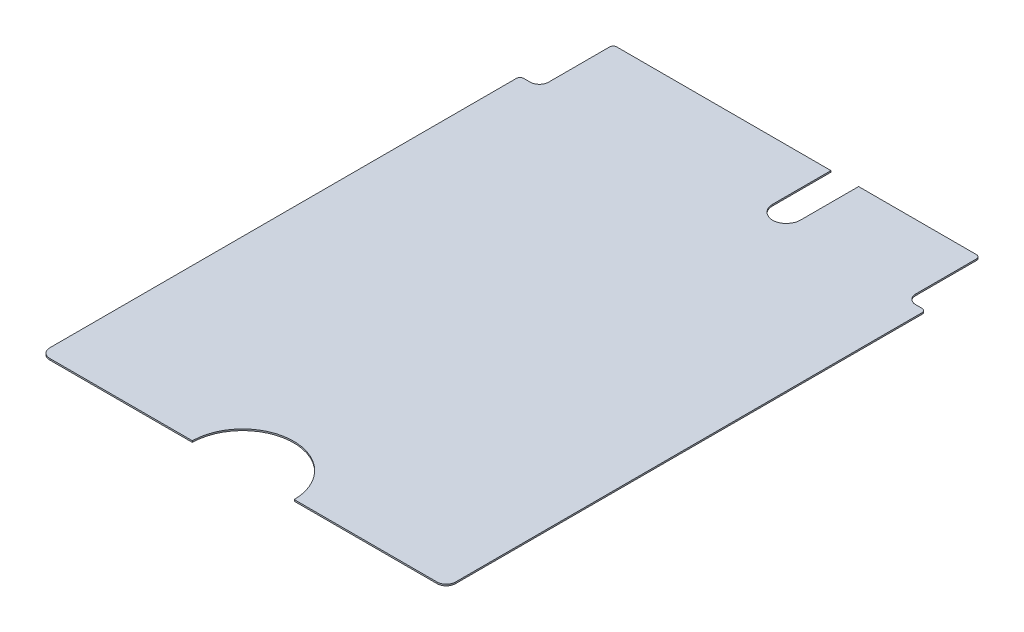
ISO-10303-21;
HEADER;
FILE_DESCRIPTION(('STEP AP214'),'2;1');
FILE_NAME('part.step','',(''),(''),'','','');
FILE_SCHEMA(('AUTOMOTIVE_DESIGN { 1 0 10303 214 1 1 1 1 }'));
ENDSEC;
DATA;
#1=APPLICATION_CONTEXT('core data for automotive mechanical design processes');
#2=APPLICATION_PROTOCOL_DEFINITION('international standard','automotive_design',2000,#1);
#3=PRODUCT_CONTEXT('',#1,'mechanical');
#4=PRODUCT('Part','Part','',(#3));
#5=PRODUCT_RELATED_PRODUCT_CATEGORY('part','',(#4));
#6=PRODUCT_DEFINITION_FORMATION('','',#4);
#7=PRODUCT_DEFINITION_CONTEXT('part definition',#1,'design');
#8=PRODUCT_DEFINITION('design','',#6,#7);
#9=PRODUCT_DEFINITION_SHAPE('','',#8);
#10=(LENGTH_UNIT() NAMED_UNIT(*) SI_UNIT(.MILLI.,.METRE.));
#11=(NAMED_UNIT(*) PLANE_ANGLE_UNIT() SI_UNIT($,.RADIAN.));
#12=(NAMED_UNIT(*) SI_UNIT($,.STERADIAN.) SOLID_ANGLE_UNIT());
#13=UNCERTAINTY_MEASURE_WITH_UNIT(LENGTH_MEASURE(1.E-05),#10,'distance_accuracy_value','');
#14=(GEOMETRIC_REPRESENTATION_CONTEXT(3) GLOBAL_UNCERTAINTY_ASSIGNED_CONTEXT((#13)) GLOBAL_UNIT_ASSIGNED_CONTEXT((#10,
#11,#12)) REPRESENTATION_CONTEXT('',''));
#15=CARTESIAN_POINT('',(0.,0.,0.));
#16=DIRECTION('',(0.,0.,1.));
#17=DIRECTION('',(1.,0.,0.));
#18=AXIS2_PLACEMENT_3D('',#15,#16,#17);
#19=CARTESIAN_POINT('',(-19.5222767349701,-34.3699379173652,9.68416125883248));
#20=DIRECTION('',(0.,1.,0.));
#21=DIRECTION('',(0.,0.,1.));
#22=AXIS2_PLACEMENT_3D('',#19,#20,#21);
#23=CYLINDRICAL_SURFACE('',#22,0.5);
#24=CARTESIAN_POINT('',(-19.5222767349701,-34.3699379173652,9.68416125883248));
#25=DIRECTION('',(0.,1.,0.));
#26=DIRECTION('',(0.,0.,1.));
#27=AXIS2_PLACEMENT_3D('',#24,#25,#26);
#28=CIRCLE('',#27,0.5);
#29=CARTESIAN_POINT('',(-19.5222767349701,-34.3699379173652,10.1841612588325));
#30=VERTEX_POINT('',#29);
#31=CARTESIAN_POINT('',(-19.0222767349701,-34.3699379173652,9.68416125883248));
#32=VERTEX_POINT('',#31);
#33=EDGE_CURVE('E239',#30,#32,#28,.T.);
#34=ORIENTED_EDGE('',*,*,#33,.F.);
#35=DIRECTION('',(0.,1.,0.));
#36=VECTOR('',#35,1.);
#37=CARTESIAN_POINT('',(-19.5222767349701,-34.3699379173652,10.1841612588325));
#38=LINE('',#37,#36);
#39=CARTESIAN_POINT('',(-19.5222767349701,-34.2899379173652,10.1841612588325));
#40=VERTEX_POINT('',#39);
#41=EDGE_CURVE('E74',#30,#40,#38,.T.);
#42=ORIENTED_EDGE('',*,*,#41,.T.);
#43=CARTESIAN_POINT('',(-19.5222767349701,-34.2899379173652,9.68416125883248));
#44=DIRECTION('',(0.,-1.,0.));
#45=DIRECTION('',(0.,0.,1.));
#46=AXIS2_PLACEMENT_3D('',#43,#44,#45);
#47=CIRCLE('',#46,0.5);
#48=CARTESIAN_POINT('',(-19.0222767349701,-34.2899379173652,9.68416125883248));
#49=VERTEX_POINT('',#48);
#50=EDGE_CURVE('E345',#49,#40,#47,.T.);
#51=ORIENTED_EDGE('',*,*,#50,.F.);
#52=DIRECTION('',(0.,1.,0.));
#53=VECTOR('',#52,1.);
#54=CARTESIAN_POINT('',(-19.0222767349701,-34.3699379173652,9.68416125883248));
#55=LINE('',#54,#53);
#56=EDGE_CURVE('E11',#32,#49,#55,.T.);
#57=ORIENTED_EDGE('',*,*,#56,.F.);
#58=EDGE_LOOP('',(#34,#42,#51,#57));
#59=FACE_BOUND('',#58,.T.);
#60=ADVANCED_FACE('F16',(#59),#23,.F.);
#61=CARTESIAN_POINT('',(-19.0222767349701,-34.3699379173652,6.3841612588325));
#62=DIRECTION('',(-1.,0.,0.));
#63=DIRECTION('',(0.,1.,0.));
#64=AXIS2_PLACEMENT_3D('',#61,#62,#63);
#65=PLANE('',#64);
#66=DIRECTION('',(0.,0.,1.));
#67=VECTOR('',#66,1.);
#68=CARTESIAN_POINT('',(-19.0222767349701,-34.3699379173652,6.3841612588325));
#69=LINE('',#68,#67);
#70=CARTESIAN_POINT('',(-19.0222767349701,-34.3699379173652,6.3841612588325));
#71=VERTEX_POINT('',#70);
#72=EDGE_CURVE('E369',#71,#32,#69,.T.);
#73=ORIENTED_EDGE('',*,*,#72,.T.);
#74=ORIENTED_EDGE('',*,*,#56,.T.);
#75=DIRECTION('',(0.,0.,1.));
#76=VECTOR('',#75,1.);
#77=CARTESIAN_POINT('',(-19.0222767349701,-34.2899379173652,6.3841612588325));
#78=LINE('',#77,#76);
#79=CARTESIAN_POINT('',(-19.0222767349701,-34.2899379173652,6.3841612588325));
#80=VERTEX_POINT('',#79);
#81=EDGE_CURVE('E284',#80,#49,#78,.T.);
#82=ORIENTED_EDGE('',*,*,#81,.F.);
#83=DIRECTION('',(0.,1.,0.));
#84=VECTOR('',#83,1.);
#85=CARTESIAN_POINT('',(-19.0222767349701,-34.3699379173652,6.3841612588325));
#86=LINE('',#85,#84);
#87=EDGE_CURVE('E26',#71,#80,#86,.T.);
#88=ORIENTED_EDGE('',*,*,#87,.F.);
#89=EDGE_LOOP('',(#73,#74,#82,#88));
#90=FACE_BOUND('',#89,.T.);
#91=ADVANCED_FACE('F18',(#90),#65,.T.);
#92=CARTESIAN_POINT('',(-18.8222767349701,-34.3699379173652,6.3841612588325));
#93=DIRECTION('',(0.,1.,0.));
#94=DIRECTION('',(0.,0.,-1.));
#95=AXIS2_PLACEMENT_3D('',#92,#93,#94);
#96=CYLINDRICAL_SURFACE('',#95,0.200000000000003);
#97=CARTESIAN_POINT('',(-18.8222767349701,-34.3699379173652,6.3841612588325));
#98=DIRECTION('',(0.,1.,0.));
#99=DIRECTION('',(0.,0.,-1.));
#100=AXIS2_PLACEMENT_3D('',#97,#98,#99);
#101=CIRCLE('',#100,0.200000000000003);
#102=CARTESIAN_POINT('',(-18.8222767349701,-34.3699379173652,6.18416125883249));
#103=VERTEX_POINT('',#102);
#104=EDGE_CURVE('E378',#103,#71,#101,.T.);
#105=ORIENTED_EDGE('',*,*,#104,.T.);
#106=ORIENTED_EDGE('',*,*,#87,.T.);
#107=CARTESIAN_POINT('',(-18.8222767349701,-34.2899379173652,6.3841612588325));
#108=DIRECTION('',(0.,1.,0.));
#109=DIRECTION('',(0.,0.,-1.));
#110=AXIS2_PLACEMENT_3D('',#107,#108,#109);
#111=CIRCLE('',#110,0.200000000000003);
#112=CARTESIAN_POINT('',(-18.8222767349701,-34.2899379173652,6.18416125883249));
#113=VERTEX_POINT('',#112);
#114=EDGE_CURVE('E437',#113,#80,#111,.T.);
#115=ORIENTED_EDGE('',*,*,#114,.F.);
#116=DIRECTION('',(0.,1.,0.));
#117=VECTOR('',#116,1.);
#118=CARTESIAN_POINT('',(-18.8222767349701,-34.3699379173652,6.18416125883249));
#119=LINE('',#118,#117);
#120=EDGE_CURVE('E307',#103,#113,#119,.T.);
#121=ORIENTED_EDGE('',*,*,#120,.F.);
#122=EDGE_LOOP('',(#105,#106,#115,#121));
#123=FACE_BOUND('',#122,.T.);
#124=ADVANCED_FACE('F500',(#123),#96,.T.);
#125=CARTESIAN_POINT('',(0.677723265029897,-34.3699379173652,6.18416125883247));
#126=DIRECTION('',(0.,0.,-1.));
#127=DIRECTION('',(-1.,0.,0.));
#128=AXIS2_PLACEMENT_3D('',#125,#126,#127);
#129=PLANE('',#128);
#130=DIRECTION('',(0.,-1.,0.));
#131=VECTOR('',#130,1.);
#132=CARTESIAN_POINT('',(-7.21499999999472,-34.3699379173652,6.18416125883247));
#133=LINE('',#132,#131);
#134=CARTESIAN_POINT('',(-7.21499999999472,-34.2899379173652,6.1841612588325));
#135=VERTEX_POINT('',#134);
#136=CARTESIAN_POINT('',(-7.21499999999472,-34.3699379173652,6.1841612588325));
#137=VERTEX_POINT('',#136);
#138=EDGE_CURVE('E349',#135,#137,#133,.T.);
#139=ORIENTED_EDGE('',*,*,#138,.T.);
#140=DIRECTION('',(-1.,0.,0.));
#141=VECTOR('',#140,1.);
#142=CARTESIAN_POINT('',(0.677723265029897,-34.3699379173652,6.18416125883247));
#143=LINE('',#142,#141);
#144=EDGE_CURVE('E381',#137,#103,#143,.T.);
#145=ORIENTED_EDGE('',*,*,#144,.T.);
#146=ORIENTED_EDGE('',*,*,#120,.T.);
#147=DIRECTION('',(-1.,0.,0.));
#148=VECTOR('',#147,1.);
#149=CARTESIAN_POINT('',(0.677723265029897,-34.2899379173652,6.18416125883247));
#150=LINE('',#149,#148);
#151=EDGE_CURVE('E303',#135,#113,#150,.T.);
#152=ORIENTED_EDGE('',*,*,#151,.F.);
#153=EDGE_LOOP('',(#139,#145,#146,#152));
#154=FACE_BOUND('',#153,.T.);
#155=ADVANCED_FACE('F497',(#154),#129,.T.);
#156=CARTESIAN_POINT('',(0.677723265029897,-34.3699379173652,6.38416125883248));
#157=DIRECTION('',(0.,1.,0.));
#158=DIRECTION('',(1.,0.,0.));
#159=AXIS2_PLACEMENT_3D('',#156,#157,#158);
#160=CYLINDRICAL_SURFACE('',#159,0.200000000000003);
#161=CARTESIAN_POINT('',(0.677723265029897,-34.3699379173652,6.38416125883248));
#162=DIRECTION('',(0.,1.,0.));
#163=DIRECTION('',(1.,0.,0.));
#164=AXIS2_PLACEMENT_3D('',#161,#162,#163);
#165=CIRCLE('',#164,0.200000000000003);
#166=CARTESIAN_POINT('',(0.877723265029857,-34.3699379173652,6.38416125883248));
#167=VERTEX_POINT('',#166);
#168=CARTESIAN_POINT('',(0.677723265029897,-34.3699379173652,6.18416125883247));
#169=VERTEX_POINT('',#168);
#170=EDGE_CURVE('E322',#167,#169,#165,.T.);
#171=ORIENTED_EDGE('',*,*,#170,.T.);
#172=DIRECTION('',(0.,1.,0.));
#173=VECTOR('',#172,1.);
#174=CARTESIAN_POINT('',(0.677723265029897,-34.3699379173652,6.18416125883247));
#175=LINE('',#174,#173);
#176=CARTESIAN_POINT('',(0.677723265029897,-34.2899379173652,6.18416125883247));
#177=VERTEX_POINT('',#176);
#178=EDGE_CURVE('E231',#169,#177,#175,.T.);
#179=ORIENTED_EDGE('',*,*,#178,.T.);
#180=CARTESIAN_POINT('',(0.677723265029897,-34.2899379173652,6.38416125883248));
#181=DIRECTION('',(0.,1.,0.));
#182=DIRECTION('',(1.,0.,0.));
#183=AXIS2_PLACEMENT_3D('',#180,#181,#182);
#184=CIRCLE('',#183,0.200000000000003);
#185=CARTESIAN_POINT('',(0.877723265029857,-34.2899379173652,6.38416125883248));
#186=VERTEX_POINT('',#185);
#187=EDGE_CURVE('E262',#186,#177,#184,.T.);
#188=ORIENTED_EDGE('',*,*,#187,.F.);
#189=DIRECTION('',(0.,1.,0.));
#190=VECTOR('',#189,1.);
#191=CARTESIAN_POINT('',(0.877723265029857,-34.3699379173652,6.38416125883248));
#192=LINE('',#191,#190);
#193=EDGE_CURVE('E190',#167,#186,#192,.T.);
#194=ORIENTED_EDGE('',*,*,#193,.F.);
#195=EDGE_LOOP('',(#171,#179,#188,#194));
#196=FACE_BOUND('',#195,.T.);
#197=ADVANCED_FACE('F578',(#196),#160,.T.);
#198=CARTESIAN_POINT('',(0.877723265029857,-34.3699379173652,9.68416125883246));
#199=DIRECTION('',(1.,0.,0.));
#200=DIRECTION('',(0.,0.,-1.));
#201=AXIS2_PLACEMENT_3D('',#198,#199,#200);
#202=PLANE('',#201);
#203=DIRECTION('',(0.,0.,-1.));
#204=VECTOR('',#203,1.);
#205=CARTESIAN_POINT('',(0.877723265029857,-34.3699379173652,9.68416125883246));
#206=LINE('',#205,#204);
#207=CARTESIAN_POINT('',(0.877723265029857,-34.3699379173652,9.68416125883246));
#208=VERTEX_POINT('',#207);
#209=EDGE_CURVE('E325',#208,#167,#206,.T.);
#210=ORIENTED_EDGE('',*,*,#209,.T.);
#211=ORIENTED_EDGE('',*,*,#193,.T.);
#212=DIRECTION('',(0.,0.,-1.));
#213=VECTOR('',#212,1.);
#214=CARTESIAN_POINT('',(0.877723265029857,-34.2899379173652,9.68416125883246));
#215=LINE('',#214,#213);
#216=CARTESIAN_POINT('',(0.877723265029857,-34.2899379173652,9.68416125883246));
#217=VERTEX_POINT('',#216);
#218=EDGE_CURVE('E265',#217,#186,#215,.T.);
#219=ORIENTED_EDGE('',*,*,#218,.F.);
#220=DIRECTION('',(0.,1.,0.));
#221=VECTOR('',#220,1.);
#222=CARTESIAN_POINT('',(0.877723265029857,-34.3699379173652,9.68416125883246));
#223=LINE('',#222,#221);
#224=EDGE_CURVE('E179',#208,#217,#223,.T.);
#225=ORIENTED_EDGE('',*,*,#224,.F.);
#226=EDGE_LOOP('',(#210,#211,#219,#225));
#227=FACE_BOUND('',#226,.T.);
#228=ADVANCED_FACE('F464',(#227),#202,.T.);
#229=CARTESIAN_POINT('',(1.37772326502997,-34.3699379173652,9.68416125883246));
#230=DIRECTION('',(0.,1.,0.));
#231=DIRECTION('',(-1.,0.,0.));
#232=AXIS2_PLACEMENT_3D('',#229,#230,#231);
#233=CYLINDRICAL_SURFACE('',#232,0.5);
#234=CARTESIAN_POINT('',(1.37772326502997,-34.3699379173652,9.68416125883246));
#235=DIRECTION('',(0.,1.,0.));
#236=DIRECTION('',(-1.,0.,0.));
#237=AXIS2_PLACEMENT_3D('',#234,#235,#236);
#238=CIRCLE('',#237,0.5);
#239=CARTESIAN_POINT('',(1.37772326502997,-34.3699379173652,10.1841612588325));
#240=VERTEX_POINT('',#239);
#241=EDGE_CURVE('E335',#208,#240,#238,.T.);
#242=ORIENTED_EDGE('',*,*,#241,.F.);
#243=ORIENTED_EDGE('',*,*,#224,.T.);
#244=CARTESIAN_POINT('',(1.37772326502997,-34.2899379173652,9.68416125883246));
#245=DIRECTION('',(0.,-1.,0.));
#246=DIRECTION('',(-1.,0.,0.));
#247=AXIS2_PLACEMENT_3D('',#244,#245,#246);
#248=CIRCLE('',#247,0.5);
#249=CARTESIAN_POINT('',(1.37772326502997,-34.2899379173652,10.1841612588325));
#250=VERTEX_POINT('',#249);
#251=EDGE_CURVE('E273',#250,#217,#248,.T.);
#252=ORIENTED_EDGE('',*,*,#251,.F.);
#253=DIRECTION('',(0.,1.,0.));
#254=VECTOR('',#253,1.);
#255=CARTESIAN_POINT('',(1.37772326502997,-34.3699379173652,10.1841612588325));
#256=LINE('',#255,#254);
#257=EDGE_CURVE('E375',#240,#250,#256,.T.);
#258=ORIENTED_EDGE('',*,*,#257,.F.);
#259=EDGE_LOOP('',(#242,#243,#252,#258));
#260=FACE_BOUND('',#259,.T.);
#261=ADVANCED_FACE('F462',(#260),#233,.F.);
#262=CARTESIAN_POINT('',(1.72772326502994,-34.3699379173652,10.1841612588325));
#263=DIRECTION('',(0.,0.,-1.));
#264=DIRECTION('',(-1.,0.,0.));
#265=AXIS2_PLACEMENT_3D('',#262,#263,#264);
#266=PLANE('',#265);
#267=DIRECTION('',(-1.,0.,0.));
#268=VECTOR('',#267,1.);
#269=CARTESIAN_POINT('',(1.72772326502994,-34.3699379173652,10.1841612588325));
#270=LINE('',#269,#268);
#271=CARTESIAN_POINT('',(1.72772326502994,-34.3699379173652,10.1841612588325));
#272=VERTEX_POINT('',#271);
#273=EDGE_CURVE('E330',#272,#240,#270,.T.);
#274=ORIENTED_EDGE('',*,*,#273,.T.);
#275=ORIENTED_EDGE('',*,*,#257,.T.);
#276=DIRECTION('',(-1.,0.,0.));
#277=VECTOR('',#276,1.);
#278=CARTESIAN_POINT('',(1.72772326502994,-34.2899379173652,10.1841612588325));
#279=LINE('',#278,#277);
#280=CARTESIAN_POINT('',(1.72772326502994,-34.2899379173652,10.1841612588325));
#281=VERTEX_POINT('',#280);
#282=EDGE_CURVE('E280',#281,#250,#279,.T.);
#283=ORIENTED_EDGE('',*,*,#282,.F.);
#284=DIRECTION('',(0.,1.,0.));
#285=VECTOR('',#284,1.);
#286=CARTESIAN_POINT('',(1.72772326502994,-34.3699379173652,10.1841612588325));
#287=LINE('',#286,#285);
#288=EDGE_CURVE('E256',#272,#281,#287,.T.);
#289=ORIENTED_EDGE('',*,*,#288,.F.);
#290=EDGE_LOOP('',(#274,#275,#283,#289));
#291=FACE_BOUND('',#290,.T.);
#292=ADVANCED_FACE('F471',(#291),#266,.T.);
#293=CARTESIAN_POINT('',(1.72772326502994,-34.3699379173652,10.3841612588325));
#294=DIRECTION('',(0.,1.,0.));
#295=DIRECTION('',(1.,0.,0.));
#296=AXIS2_PLACEMENT_3D('',#293,#294,#295);
#297=CYLINDRICAL_SURFACE('',#296,0.200000000000003);
#298=CARTESIAN_POINT('',(1.72772326502994,-34.3699379173652,10.3841612588325));
#299=DIRECTION('',(0.,1.,0.));
#300=DIRECTION('',(1.,0.,0.));
#301=AXIS2_PLACEMENT_3D('',#298,#299,#300);
#302=CIRCLE('',#301,0.200000000000003);
#303=CARTESIAN_POINT('',(1.9277232650299,-34.3699379173652,10.3841612588325));
#304=VERTEX_POINT('',#303);
#305=EDGE_CURVE('E334',#304,#272,#302,.T.);
#306=ORIENTED_EDGE('',*,*,#305,.T.);
#307=ORIENTED_EDGE('',*,*,#288,.T.);
#308=CARTESIAN_POINT('',(1.72772326502994,-34.2899379173652,10.3841612588325));
#309=DIRECTION('',(0.,1.,0.));
#310=DIRECTION('',(1.,0.,0.));
#311=AXIS2_PLACEMENT_3D('',#308,#309,#310);
#312=CIRCLE('',#311,0.200000000000003);
#313=CARTESIAN_POINT('',(1.9277232650299,-34.2899379173652,10.3841612588325));
#314=VERTEX_POINT('',#313);
#315=EDGE_CURVE('E299',#314,#281,#312,.T.);
#316=ORIENTED_EDGE('',*,*,#315,.F.);
#317=DIRECTION('',(0.,1.,0.));
#318=VECTOR('',#317,1.);
#319=CARTESIAN_POINT('',(1.9277232650299,-34.3699379173652,10.3841612588325));
#320=LINE('',#319,#318);
#321=EDGE_CURVE('E445',#304,#314,#320,.T.);
#322=ORIENTED_EDGE('',*,*,#321,.F.);
#323=EDGE_LOOP('',(#306,#307,#316,#322));
#324=FACE_BOUND('',#323,.T.);
#325=ADVANCED_FACE('F549',(#324),#297,.T.);
#326=CARTESIAN_POINT('',(1.9277232650299,-34.3699379173652,35.6841612588325));
#327=DIRECTION('',(1.,0.,0.));
#328=DIRECTION('',(0.,0.,-1.));
#329=AXIS2_PLACEMENT_3D('',#326,#327,#328);
#330=PLANE('',#329);
#331=DIRECTION('',(0.,0.,-1.));
#332=VECTOR('',#331,1.);
#333=CARTESIAN_POINT('',(1.9277232650299,-34.3699379173652,35.6841612588325));
#334=LINE('',#333,#332);
#335=CARTESIAN_POINT('',(1.9277232650299,-34.3699379173652,35.6841612588325));
#336=VERTEX_POINT('',#335);
#337=EDGE_CURVE('E360',#336,#304,#334,.T.);
#338=ORIENTED_EDGE('',*,*,#337,.T.);
#339=ORIENTED_EDGE('',*,*,#321,.T.);
#340=DIRECTION('',(0.,0.,-1.));
#341=VECTOR('',#340,1.);
#342=CARTESIAN_POINT('',(1.9277232650299,-34.2899379173652,35.6841612588325));
#343=LINE('',#342,#341);
#344=CARTESIAN_POINT('',(1.9277232650299,-34.2899379173652,35.6841612588325));
#345=VERTEX_POINT('',#344);
#346=EDGE_CURVE('E295',#345,#314,#343,.T.);
#347=ORIENTED_EDGE('',*,*,#346,.F.);
#348=DIRECTION('',(0.,1.,0.));
#349=VECTOR('',#348,1.);
#350=CARTESIAN_POINT('',(1.9277232650299,-34.3699379173652,35.6841612588325));
#351=LINE('',#350,#349);
#352=EDGE_CURVE('E39',#336,#345,#351,.T.);
#353=ORIENTED_EDGE('',*,*,#352,.F.);
#354=EDGE_LOOP('',(#338,#339,#347,#353));
#355=FACE_BOUND('',#354,.T.);
#356=ADVANCED_FACE('F547',(#355),#330,.T.);
#357=CARTESIAN_POINT('',(1.42772326502993,-34.3699379173652,35.6841612588325));
#358=DIRECTION('',(0.,1.,0.));
#359=DIRECTION('',(0.,0.,1.));
#360=AXIS2_PLACEMENT_3D('',#357,#358,#359);
#361=CYLINDRICAL_SURFACE('',#360,0.5);
#362=CARTESIAN_POINT('',(1.42772326502993,-34.3699379173652,35.6841612588325));
#363=DIRECTION('',(0.,1.,0.));
#364=DIRECTION('',(0.,0.,1.));
#365=AXIS2_PLACEMENT_3D('',#362,#363,#364);
#366=CIRCLE('',#365,0.5);
#367=CARTESIAN_POINT('',(1.42772326502993,-34.3699379173652,36.1841612588325));
#368=VERTEX_POINT('',#367);
#369=EDGE_CURVE('E340',#368,#336,#366,.T.);
#370=ORIENTED_EDGE('',*,*,#369,.T.);
#371=ORIENTED_EDGE('',*,*,#352,.T.);
#372=CARTESIAN_POINT('',(1.42772326502993,-34.2899379173652,35.6841612588325));
#373=DIRECTION('',(0.,1.,0.));
#374=DIRECTION('',(0.,0.,1.));
#375=AXIS2_PLACEMENT_3D('',#372,#373,#374);
#376=CIRCLE('',#375,0.5);
#377=CARTESIAN_POINT('',(1.42772326502993,-34.2899379173652,36.1841612588325));
#378=VERTEX_POINT('',#377);
#379=EDGE_CURVE('E293',#378,#345,#376,.T.);
#380=ORIENTED_EDGE('',*,*,#379,.F.);
#381=DIRECTION('',(0.,1.,0.));
#382=VECTOR('',#381,1.);
#383=CARTESIAN_POINT('',(1.42772326502993,-34.3699379173652,36.1841612588325));
#384=LINE('',#383,#382);
#385=EDGE_CURVE('E365',#368,#378,#384,.T.);
#386=ORIENTED_EDGE('',*,*,#385,.F.);
#387=EDGE_LOOP('',(#370,#371,#380,#386));
#388=FACE_BOUND('',#387,.T.);
#389=ADVANCED_FACE('F521',(#388),#361,.T.);
#390=CARTESIAN_POINT('',(-19.5722767349702,-34.3699379173652,35.6841612588325));
#391=DIRECTION('',(0.,1.,0.));
#392=DIRECTION('',(-1.,0.,0.));
#393=AXIS2_PLACEMENT_3D('',#390,#391,#392);
#394=CYLINDRICAL_SURFACE('',#393,0.5);
#395=CARTESIAN_POINT('',(-19.5722767349702,-34.3699379173652,35.6841612588325));
#396=DIRECTION('',(0.,1.,0.));
#397=DIRECTION('',(-1.,0.,0.));
#398=AXIS2_PLACEMENT_3D('',#395,#396,#397);
#399=CIRCLE('',#398,0.5);
#400=CARTESIAN_POINT('',(-20.0722767349701,-34.3699379173652,35.6841612588325));
#401=VERTEX_POINT('',#400);
#402=CARTESIAN_POINT('',(-19.5722767349702,-34.3699379173652,36.1841612588325));
#403=VERTEX_POINT('',#402);
#404=EDGE_CURVE('E252',#401,#403,#399,.T.);
#405=ORIENTED_EDGE('',*,*,#404,.T.);
#406=DIRECTION('',(0.,1.,0.));
#407=VECTOR('',#406,1.);
#408=CARTESIAN_POINT('',(-19.5722767349702,-34.3699379173652,36.1841612588325));
#409=LINE('',#408,#407);
#410=CARTESIAN_POINT('',(-19.5722767349702,-34.2899379173652,36.1841612588325));
#411=VERTEX_POINT('',#410);
#412=EDGE_CURVE('E336',#403,#411,#409,.T.);
#413=ORIENTED_EDGE('',*,*,#412,.T.);
#414=CARTESIAN_POINT('',(-19.5722767349702,-34.2899379173652,35.6841612588325));
#415=DIRECTION('',(0.,1.,0.));
#416=DIRECTION('',(-1.,0.,0.));
#417=AXIS2_PLACEMENT_3D('',#414,#415,#416);
#418=CIRCLE('',#417,0.5);
#419=CARTESIAN_POINT('',(-20.0722767349701,-34.2899379173652,35.6841612588325));
#420=VERTEX_POINT('',#419);
#421=EDGE_CURVE('E433',#420,#411,#418,.T.);
#422=ORIENTED_EDGE('',*,*,#421,.F.);
#423=DIRECTION('',(0.,1.,0.));
#424=VECTOR('',#423,1.);
#425=CARTESIAN_POINT('',(-20.0722767349701,-34.3699379173652,35.6841612588325));
#426=LINE('',#425,#424);
#427=EDGE_CURVE('E288',#401,#420,#426,.T.);
#428=ORIENTED_EDGE('',*,*,#427,.F.);
#429=EDGE_LOOP('',(#405,#413,#422,#428));
#430=FACE_BOUND('',#429,.T.);
#431=ADVANCED_FACE('F531',(#430),#394,.T.);
#432=CARTESIAN_POINT('',(-20.0722767349701,-34.3699379173652,10.3841612588325));
#433=DIRECTION('',(-1.,0.,0.));
#434=DIRECTION('',(0.,1.,0.));
#435=AXIS2_PLACEMENT_3D('',#432,#433,#434);
#436=PLANE('',#435);
#437=DIRECTION('',(0.,0.,1.));
#438=VECTOR('',#437,1.);
#439=CARTESIAN_POINT('',(-20.0722767349701,-34.3699379173652,10.3841612588325));
#440=LINE('',#439,#438);
#441=CARTESIAN_POINT('',(-20.0722767349701,-34.3699379173652,10.3841612588325));
#442=VERTEX_POINT('',#441);
#443=EDGE_CURVE('E245',#442,#401,#440,.T.);
#444=ORIENTED_EDGE('',*,*,#443,.T.);
#445=ORIENTED_EDGE('',*,*,#427,.T.);
#446=DIRECTION('',(0.,0.,1.));
#447=VECTOR('',#446,1.);
#448=CARTESIAN_POINT('',(-20.0722767349701,-34.2899379173652,10.3841612588325));
#449=LINE('',#448,#447);
#450=CARTESIAN_POINT('',(-20.0722767349701,-34.2899379173652,10.3841612588325));
#451=VERTEX_POINT('',#450);
#452=EDGE_CURVE('E318',#451,#420,#449,.T.);
#453=ORIENTED_EDGE('',*,*,#452,.F.);
#454=DIRECTION('',(0.,1.,0.));
#455=VECTOR('',#454,1.);
#456=CARTESIAN_POINT('',(-20.0722767349701,-34.3699379173652,10.3841612588325));
#457=LINE('',#456,#455);
#458=EDGE_CURVE('E286',#442,#451,#457,.T.);
#459=ORIENTED_EDGE('',*,*,#458,.F.);
#460=EDGE_LOOP('',(#444,#445,#453,#459));
#461=FACE_BOUND('',#460,.T.);
#462=ADVANCED_FACE('F536',(#461),#436,.T.);
#463=CARTESIAN_POINT('',(-19.87227673497,-34.3699379173652,10.3841612588325));
#464=DIRECTION('',(0.,1.,0.));
#465=DIRECTION('',(0.,0.,-1.));
#466=AXIS2_PLACEMENT_3D('',#463,#464,#465);
#467=CYLINDRICAL_SURFACE('',#466,0.2);
#468=CARTESIAN_POINT('',(-19.87227673497,-34.3699379173652,10.3841612588325));
#469=DIRECTION('',(0.,1.,0.));
#470=DIRECTION('',(0.,0.,-1.));
#471=AXIS2_PLACEMENT_3D('',#468,#469,#470);
#472=CIRCLE('',#471,0.2);
#473=CARTESIAN_POINT('',(-19.87227673497,-34.3699379173652,10.1841612588325));
#474=VERTEX_POINT('',#473);
#475=EDGE_CURVE('E224',#474,#442,#472,.T.);
#476=ORIENTED_EDGE('',*,*,#475,.T.);
#477=ORIENTED_EDGE('',*,*,#458,.T.);
#478=CARTESIAN_POINT('',(-19.87227673497,-34.2899379173652,10.3841612588325));
#479=DIRECTION('',(0.,1.,0.));
#480=DIRECTION('',(0.,0.,-1.));
#481=AXIS2_PLACEMENT_3D('',#478,#479,#480);
#482=CIRCLE('',#481,0.2);
#483=CARTESIAN_POINT('',(-19.87227673497,-34.2899379173652,10.1841612588325));
#484=VERTEX_POINT('',#483);
#485=EDGE_CURVE('E227',#484,#451,#482,.T.);
#486=ORIENTED_EDGE('',*,*,#485,.F.);
#487=DIRECTION('',(0.,1.,0.));
#488=VECTOR('',#487,1.);
#489=CARTESIAN_POINT('',(-19.87227673497,-34.3699379173652,10.1841612588325));
#490=LINE('',#489,#488);
#491=EDGE_CURVE('E220',#474,#484,#490,.T.);
#492=ORIENTED_EDGE('',*,*,#491,.F.);
#493=EDGE_LOOP('',(#476,#477,#486,#492));
#494=FACE_BOUND('',#493,.T.);
#495=ADVANCED_FACE('F222',(#494),#467,.T.);
#496=CARTESIAN_POINT('',(-19.5222767349701,-34.3699379173652,10.1841612588325));
#497=DIRECTION('',(0.,0.,-1.));
#498=DIRECTION('',(-1.,0.,0.));
#499=AXIS2_PLACEMENT_3D('',#496,#497,#498);
#500=PLANE('',#499);
#501=DIRECTION('',(-1.,0.,0.));
#502=VECTOR('',#501,1.);
#503=CARTESIAN_POINT('',(-19.5222767349701,-34.3699379173652,10.1841612588325));
#504=LINE('',#503,#502);
#505=EDGE_CURVE('E234',#30,#474,#504,.T.);
#506=ORIENTED_EDGE('',*,*,#505,.T.);
#507=ORIENTED_EDGE('',*,*,#491,.T.);
#508=DIRECTION('',(-1.,0.,0.));
#509=VECTOR('',#508,1.);
#510=CARTESIAN_POINT('',(-19.5222767349701,-34.2899379173652,10.1841612588325));
#511=LINE('',#510,#509);
#512=EDGE_CURVE('E319',#40,#484,#511,.T.);
#513=ORIENTED_EDGE('',*,*,#512,.F.);
#514=ORIENTED_EDGE('',*,*,#41,.F.);
#515=EDGE_LOOP('',(#506,#507,#513,#514));
#516=FACE_BOUND('',#515,.T.);
#517=ADVANCED_FACE('F235',(#516),#500,.T.);
#518=CARTESIAN_POINT('',(0.677723265029897,-34.3699379173652,6.18416125883247));
#519=DIRECTION('',(0.,0.,-1.));
#520=DIRECTION('',(-1.,0.,0.));
#521=AXIS2_PLACEMENT_3D('',#518,#519,#520);
#522=PLANE('',#521);
#523=DIRECTION('',(0.,1.,0.));
#524=VECTOR('',#523,1.);
#525=CARTESIAN_POINT('',(-5.71500000000405,-34.3699379173652,6.18416125883247));
#526=LINE('',#525,#524);
#527=CARTESIAN_POINT('',(-5.71500000000405,-34.3699379173652,6.1841612588325));
#528=VERTEX_POINT('',#527);
#529=CARTESIAN_POINT('',(-5.71500000000405,-34.2899379173652,6.1841612588325));
#530=VERTEX_POINT('',#529);
#531=EDGE_CURVE('E406',#528,#530,#526,.T.);
#532=ORIENTED_EDGE('',*,*,#531,.T.);
#533=DIRECTION('',(-1.,0.,0.));
#534=VECTOR('',#533,1.);
#535=CARTESIAN_POINT('',(0.677723265029897,-34.2899379173652,6.18416125883247));
#536=LINE('',#535,#534);
#537=EDGE_CURVE('E261',#177,#530,#536,.T.);
#538=ORIENTED_EDGE('',*,*,#537,.F.);
#539=ORIENTED_EDGE('',*,*,#178,.F.);
#540=DIRECTION('',(-1.,0.,0.));
#541=VECTOR('',#540,1.);
#542=CARTESIAN_POINT('',(0.677723265029897,-34.3699379173652,6.18416125883247));
#543=LINE('',#542,#541);
#544=EDGE_CURVE('E326',#169,#528,#543,.T.);
#545=ORIENTED_EDGE('',*,*,#544,.T.);
#546=EDGE_LOOP('',(#532,#538,#539,#545));
#547=FACE_BOUND('',#546,.T.);
#548=ADVANCED_FACE('F599',(#547),#522,.T.);
#549=CARTESIAN_POINT('',(-7.21499999999472,-34.3699379173652,6.1841612588325));
#550=DIRECTION('',(-1.,0.,0.));
#551=DIRECTION('',(0.,0.,1.));
#552=AXIS2_PLACEMENT_3D('',#549,#550,#551);
#553=PLANE('',#552);
#554=DIRECTION('',(0.,0.,1.));
#555=VECTOR('',#554,1.);
#556=CARTESIAN_POINT('',(-7.21499999999471,-34.3699379173652,2.93418625883247));
#557=LINE('',#556,#555);
#558=CARTESIAN_POINT('',(-7.21499999999221,-34.3699379173652,9.35003153362687));
#559=VERTEX_POINT('',#558);
#560=EDGE_CURVE('E388',#137,#559,#557,.T.);
#561=ORIENTED_EDGE('',*,*,#560,.F.);
#562=ORIENTED_EDGE('',*,*,#138,.F.);
#563=DIRECTION('',(0.,0.,-1.));
#564=VECTOR('',#563,1.);
#565=CARTESIAN_POINT('',(-7.21499999999471,-34.2899379173652,2.93418625883247));
#566=LINE('',#565,#564);
#567=CARTESIAN_POINT('',(-7.21499999999221,-34.2899379173652,9.35003153362687));
#568=VERTEX_POINT('',#567);
#569=EDGE_CURVE('E300',#568,#135,#566,.T.);
#570=ORIENTED_EDGE('',*,*,#569,.F.);
#571=DIRECTION('',(0.,1.,0.));
#572=VECTOR('',#571,1.);
#573=CARTESIAN_POINT('',(-7.21499999999221,-34.3699379173652,9.35003153362687));
#574=LINE('',#573,#572);
#575=EDGE_CURVE('E353',#559,#568,#574,.T.);
#576=ORIENTED_EDGE('',*,*,#575,.F.);
#577=EDGE_LOOP('',(#561,#562,#570,#576));
#578=FACE_BOUND('',#577,.T.);
#579=ADVANCED_FACE('F602',(#578),#553,.F.);
#580=CARTESIAN_POINT('',(-7.21499999999221,-34.3699379173652,9.35003153362687));
#581=CARTESIAN_POINT('',(-7.21499999999221,-34.2899379173652,9.35003153362687));
#582=CARTESIAN_POINT('',(-7.21499972228489,-34.3699379173652,9.40970292928749));
#583=CARTESIAN_POINT('',(-7.21499972228489,-34.2899379173652,9.40970292928749));
#584=CARTESIAN_POINT('',(-7.20784447686593,-34.3699379173652,9.46937107249866));
#585=CARTESIAN_POINT('',(-7.20784447686593,-34.2899379173652,9.46937107249866));
#586=CARTESIAN_POINT('',(-7.19373635685648,-34.3699379173652,9.52735069314218));
#587=CARTESIAN_POINT('',(-7.19373635685648,-34.2899379173652,9.52735069314218));
#588=CARTESIAN_POINT('',(-7.10783669670301,-34.3699379173652,9.88036935939766));
#589=CARTESIAN_POINT('',(-7.10783669670301,-34.2899379173652,9.88036935939766));
#590=CARTESIAN_POINT('',(-6.73499919631506,-34.3699379173652,10.1384450421497));
#591=CARTESIAN_POINT('',(-6.73499919631506,-34.2899379173652,10.1384450421497));
#592=CARTESIAN_POINT('',(-6.37434382235639,-34.3699379173652,10.0945288540557));
#593=CARTESIAN_POINT('',(-6.37434382235639,-34.2899379173652,10.0945288540557));
#594=CARTESIAN_POINT('',(-6.01459595014111,-34.3699379173652,10.0507231703937));
#595=CARTESIAN_POINT('',(-6.01459595014111,-34.2899379173652,10.0507231703937));
#596=CARTESIAN_POINT('',(-5.71500168664371,-34.3699379173652,9.71243665157274));
#597=CARTESIAN_POINT('',(-5.71500168664371,-34.2899379173652,9.71243665157274));
#598=CARTESIAN_POINT('',(-5.71500000000765,-34.3699379173652,9.35003153367453));
#599=CARTESIAN_POINT('',(-5.71500000000765,-34.2899379173652,9.35003153367453));
#600=(BOUNDED_SURFACE() B_SPLINE_SURFACE(3,1,((#580,#581),(#582,#583),(#584,#585),(#586,#587),
(#588,#589),(#590,#591),(#592,#593),(#594,#595),(#596,#597),(#598,#599)),.UNSPECIFIED.,.F.,.F.,
.F.) B_SPLINE_SURFACE_WITH_KNOTS((4,3,3,4),(2,2),(1.29039237993196E-06,0.238686873043451,
1.69196416438608,3.14158463603113),(0.,0.008),
.UNSPECIFIED.) GEOMETRIC_REPRESENTATION_ITEM() RATIONAL_B_SPLINE_SURFACE(((1.,1.),(1.,1.),(1.,
1.),(1.,1.),(1.,1.),(1.,1.),(1.,1.),(1.,1.),(1.,1.),(1.,1.))) REPRESENTATION_ITEM('') SURFACE());
#601=CARTESIAN_POINT('',(-7.21499999999221,-34.3699379173652,9.35003153362687));
#602=CARTESIAN_POINT('',(-7.21499972228489,-34.3699379173652,9.40970292928749));
#603=CARTESIAN_POINT('',(-7.20784447686593,-34.3699379173652,9.46937107249866));
#604=CARTESIAN_POINT('',(-7.19373635685648,-34.3699379173652,9.52735069314218));
#605=CARTESIAN_POINT('',(-7.10783669670301,-34.3699379173652,9.88036935939766));
#606=CARTESIAN_POINT('',(-6.73499919631506,-34.3699379173652,10.1384450421497));
#607=CARTESIAN_POINT('',(-6.37434382235639,-34.3699379173652,10.0945288540557));
#608=CARTESIAN_POINT('',(-6.01459595014111,-34.3699379173652,10.0507231703937));
#609=CARTESIAN_POINT('',(-5.71500168664371,-34.3699379173652,9.71243665157274));
#610=CARTESIAN_POINT('',(-5.71500000000765,-34.3699379173652,9.35003153367453));
#611=(BOUNDED_CURVE() B_SPLINE_CURVE(3,(#601,#602,#603,#604,#605,#606,#607,#608,#609,#610),
.UNSPECIFIED.,.F.,.F.) B_SPLINE_CURVE_WITH_KNOTS((4,3,3,4),(1.29039237993196E-06,
0.238686873043451,1.69196416438608,3.14158463603113),
.UNSPECIFIED.) CURVE() GEOMETRIC_REPRESENTATION_ITEM() RATIONAL_B_SPLINE_CURVE((1.,1.,1.,1.,1.,
1.,1.,1.,1.,1.)) REPRESENTATION_ITEM(''));
#612=CARTESIAN_POINT('',(-5.71500000000765,-34.3699379173652,9.35003153367453));
#613=VERTEX_POINT('',#612);
#614=EDGE_CURVE('E374',#559,#613,#611,.T.);
#615=CARTESIAN_POINT('',(-5.71500000000765,-34.2899379173652,9.35003153367453));
#616=CARTESIAN_POINT('',(-5.71500168664371,-34.2899379173652,9.71243665157274));
#617=CARTESIAN_POINT('',(-6.01459595014111,-34.2899379173652,10.0507231703937));
#618=CARTESIAN_POINT('',(-6.37434382235639,-34.2899379173652,10.0945288540557));
#619=CARTESIAN_POINT('',(-6.73499919631506,-34.2899379173652,10.1384450421497));
#620=CARTESIAN_POINT('',(-7.10783669670301,-34.2899379173652,9.88036935939766));
#621=CARTESIAN_POINT('',(-7.19373635685648,-34.2899379173652,9.52735069314218));
#622=CARTESIAN_POINT('',(-7.20784447686593,-34.2899379173652,9.46937107249866));
#623=CARTESIAN_POINT('',(-7.21499972228489,-34.2899379173652,9.40970292928749));
#624=CARTESIAN_POINT('',(-7.21499999999221,-34.2899379173652,9.35003153362687));
#625=(BOUNDED_CURVE() B_SPLINE_CURVE(3,(#615,#616,#617,#618,#619,#620,#621,#622,#623,#624),
.UNSPECIFIED.,.F.,.F.) B_SPLINE_CURVE_WITH_KNOTS((4,3,3,4),(-3.14158463603113,-1.69196416438608,
-0.238686873043451,-1.29039237993196E-06),
.UNSPECIFIED.) CURVE() GEOMETRIC_REPRESENTATION_ITEM() RATIONAL_B_SPLINE_CURVE((1.,1.,1.,1.,1.,
1.,1.,1.,1.,1.)) REPRESENTATION_ITEM(''));
#626=CARTESIAN_POINT('',(-5.71500000000765,-34.2899379173652,9.35003153367453));
#627=VERTEX_POINT('',#626);
#628=EDGE_CURVE('E260',#627,#568,#625,.T.);
#629=DIRECTION('',(0.,1.,0.));
#630=VECTOR('',#629,1.);
#631=CARTESIAN_POINT('',(-5.71500000000765,-34.3699379173652,9.35003153367453));
#632=LINE('',#631,#630);
#633=EDGE_CURVE('E339',#613,#627,#632,.T.);
#634=ORIENTED_EDGE('',*,*,#614,.F.);
#635=ORIENTED_EDGE('',*,*,#575,.T.);
#636=ORIENTED_EDGE('',*,*,#628,.F.);
#637=ORIENTED_EDGE('',*,*,#633,.F.);
#638=EDGE_LOOP('',(#634,#635,#636,#637));
#639=FACE_BOUND('',#638,.T.);
#640=ADVANCED_FACE('F596',(#639),#600,.F.);
#641=CARTESIAN_POINT('',(-5.71500000000405,-34.3699379173652,9.35003153367453));
#642=DIRECTION('',(1.,0.,0.));
#643=DIRECTION('',(0.,0.,-1.));
#644=AXIS2_PLACEMENT_3D('',#641,#642,#643);
#645=PLANE('',#644);
#646=DIRECTION('',(0.,0.,-1.));
#647=VECTOR('',#646,1.);
#648=CARTESIAN_POINT('',(-5.71500000000406,-34.3699379173652,4.51712139625357));
#649=LINE('',#648,#647);
#650=EDGE_CURVE('E370',#613,#528,#649,.T.);
#651=ORIENTED_EDGE('',*,*,#650,.F.);
#652=ORIENTED_EDGE('',*,*,#633,.T.);
#653=DIRECTION('',(0.,0.,1.));
#654=VECTOR('',#653,1.);
#655=CARTESIAN_POINT('',(-5.71500000000406,-34.2899379173652,4.51712139625357));
#656=LINE('',#655,#654);
#657=EDGE_CURVE('E258',#530,#627,#656,.T.);
#658=ORIENTED_EDGE('',*,*,#657,.F.);
#659=ORIENTED_EDGE('',*,*,#531,.F.);
#660=EDGE_LOOP('',(#651,#652,#658,#659));
#661=FACE_BOUND('',#660,.T.);
#662=ADVANCED_FACE('F575',(#661),#645,.F.);
#663=CARTESIAN_POINT('',(-19.5722767349702,-34.3699379173652,36.1841612588325));
#664=DIRECTION('',(0.,0.,1.));
#665=DIRECTION('',(1.,0.,0.));
#666=AXIS2_PLACEMENT_3D('',#663,#664,#665);
#667=PLANE('',#666);
#668=DIRECTION('',(0.,1.,0.));
#669=VECTOR('',#668,1.);
#670=CARTESIAN_POINT('',(-11.8436051344364,-34.3699379173652,36.1841612588325));
#671=LINE('',#670,#669);
#672=CARTESIAN_POINT('',(-11.8436051344364,-34.3699379173652,36.1841612588325));
#673=VERTEX_POINT('',#672);
#674=CARTESIAN_POINT('',(-11.8436051344364,-34.2899379173652,36.1841612588325));
#675=VERTEX_POINT('',#674);
#676=EDGE_CURVE('E294',#673,#675,#671,.T.);
#677=ORIENTED_EDGE('',*,*,#676,.T.);
#678=DIRECTION('',(1.,0.,0.));
#679=VECTOR('',#678,1.);
#680=CARTESIAN_POINT('',(-19.5722767349702,-34.2899379173652,36.1841612588325));
#681=LINE('',#680,#679);
#682=EDGE_CURVE('E366',#411,#675,#681,.T.);
#683=ORIENTED_EDGE('',*,*,#682,.F.);
#684=ORIENTED_EDGE('',*,*,#412,.F.);
#685=DIRECTION('',(1.,0.,0.));
#686=VECTOR('',#685,1.);
#687=CARTESIAN_POINT('',(-19.5722767349702,-34.3699379173652,36.1841612588325));
#688=LINE('',#687,#686);
#689=EDGE_CURVE('E344',#403,#673,#688,.T.);
#690=ORIENTED_EDGE('',*,*,#689,.T.);
#691=EDGE_LOOP('',(#677,#683,#684,#690));
#692=FACE_BOUND('',#691,.T.);
#693=ADVANCED_FACE('F529',(#692),#667,.T.);
#694=CARTESIAN_POINT('',(59.5028232650299,-34.3699379173652,-0.315788741167555));
#695=DIRECTION('',(0.,1.,0.));
#696=DIRECTION('',(0.,0.,-1.));
#697=AXIS2_PLACEMENT_3D('',#694,#695,#696);
#698=PLANE('',#697);
#699=CARTESIAN_POINT('',(-9.07999999999982,-34.3699379173652,36.2199999999995));
#700=DIRECTION('',(0.,1.,0.));
#701=DIRECTION('',(1.,0.,0.));
#702=AXIS2_PLACEMENT_3D('',#699,#700,#701);
#703=CIRCLE('',#702,2.76383750507377);
#704=CARTESIAN_POINT('',(-6.31639486556329,-34.3699379173652,36.1841612588325));
#705=VERTEX_POINT('',#704);
#706=EDGE_CURVE('E411',#705,#673,#703,.T.);
#707=ORIENTED_EDGE('',*,*,#706,.T.);
#708=ORIENTED_EDGE('',*,*,#689,.F.);
#709=ORIENTED_EDGE('',*,*,#404,.F.);
#710=ORIENTED_EDGE('',*,*,#443,.F.);
#711=ORIENTED_EDGE('',*,*,#475,.F.);
#712=ORIENTED_EDGE('',*,*,#505,.F.);
#713=ORIENTED_EDGE('',*,*,#33,.T.);
#714=ORIENTED_EDGE('',*,*,#72,.F.);
#715=ORIENTED_EDGE('',*,*,#104,.F.);
#716=ORIENTED_EDGE('',*,*,#144,.F.);
#717=ORIENTED_EDGE('',*,*,#560,.T.);
#718=ORIENTED_EDGE('',*,*,#614,.T.);
#719=ORIENTED_EDGE('',*,*,#650,.T.);
#720=ORIENTED_EDGE('',*,*,#544,.F.);
#721=ORIENTED_EDGE('',*,*,#170,.F.);
#722=ORIENTED_EDGE('',*,*,#209,.F.);
#723=ORIENTED_EDGE('',*,*,#241,.T.);
#724=ORIENTED_EDGE('',*,*,#273,.F.);
#725=ORIENTED_EDGE('',*,*,#305,.F.);
#726=ORIENTED_EDGE('',*,*,#337,.F.);
#727=ORIENTED_EDGE('',*,*,#369,.F.);
#728=DIRECTION('',(1.,0.,0.));
#729=VECTOR('',#728,1.);
#730=CARTESIAN_POINT('',(-19.5722767349702,-34.3699379173652,36.1841612588325));
#731=LINE('',#730,#729);
#732=EDGE_CURVE('E361',#705,#368,#731,.T.);
#733=ORIENTED_EDGE('',*,*,#732,.F.);
#734=EDGE_LOOP('',(#707,#708,#709,#710,#711,#712,#713,#714,#715,#716,#717,#718,#719,#720,#721,
#722,#723,#724,#725,#726,#727,#733));
#735=FACE_BOUND('',#734,.T.);
#736=ADVANCED_FACE('F242',(#735),#698,.F.);
#737=CARTESIAN_POINT('',(-19.5722767349702,-34.3699379173652,36.1841612588325));
#738=DIRECTION('',(0.,0.,1.));
#739=DIRECTION('',(1.,0.,0.));
#740=AXIS2_PLACEMENT_3D('',#737,#738,#739);
#741=PLANE('',#740);
#742=DIRECTION('',(0.,-1.,0.));
#743=VECTOR('',#742,1.);
#744=CARTESIAN_POINT('',(-6.31639486556329,-34.3699379173652,36.1841612588325));
#745=LINE('',#744,#743);
#746=CARTESIAN_POINT('',(-6.31639486556329,-34.2899379173652,36.1841612588325));
#747=VERTEX_POINT('',#746);
#748=EDGE_CURVE('E402',#747,#705,#745,.T.);
#749=ORIENTED_EDGE('',*,*,#748,.T.);
#750=ORIENTED_EDGE('',*,*,#732,.T.);
#751=ORIENTED_EDGE('',*,*,#385,.T.);
#752=DIRECTION('',(1.,0.,0.));
#753=VECTOR('',#752,1.);
#754=CARTESIAN_POINT('',(-19.5722767349702,-34.2899379173652,36.1841612588325));
#755=LINE('',#754,#753);
#756=EDGE_CURVE('E289',#747,#378,#755,.T.);
#757=ORIENTED_EDGE('',*,*,#756,.F.);
#758=EDGE_LOOP('',(#749,#750,#751,#757));
#759=FACE_BOUND('',#758,.T.);
#760=ADVANCED_FACE('F518',(#759),#741,.T.);
#761=CARTESIAN_POINT('',(59.5028232650299,-34.2899379173652,-0.315788741167555));
#762=DIRECTION('',(0.,1.,0.));
#763=DIRECTION('',(0.,0.,-1.));
#764=AXIS2_PLACEMENT_3D('',#761,#762,#763);
#765=PLANE('',#764);
#766=CARTESIAN_POINT('',(-9.07999999999982,-34.2899379173652,36.2199999999995));
#767=DIRECTION('',(0.,-1.,0.));
#768=DIRECTION('',(1.,0.,0.));
#769=AXIS2_PLACEMENT_3D('',#766,#767,#768);
#770=CIRCLE('',#769,2.76383750507377);
#771=EDGE_CURVE('E315',#675,#747,#770,.T.);
#772=ORIENTED_EDGE('',*,*,#771,.T.);
#773=ORIENTED_EDGE('',*,*,#756,.T.);
#774=ORIENTED_EDGE('',*,*,#379,.T.);
#775=ORIENTED_EDGE('',*,*,#346,.T.);
#776=ORIENTED_EDGE('',*,*,#315,.T.);
#777=ORIENTED_EDGE('',*,*,#282,.T.);
#778=ORIENTED_EDGE('',*,*,#251,.T.);
#779=ORIENTED_EDGE('',*,*,#218,.T.);
#780=ORIENTED_EDGE('',*,*,#187,.T.);
#781=ORIENTED_EDGE('',*,*,#537,.T.);
#782=ORIENTED_EDGE('',*,*,#657,.T.);
#783=ORIENTED_EDGE('',*,*,#628,.T.);
#784=ORIENTED_EDGE('',*,*,#569,.T.);
#785=ORIENTED_EDGE('',*,*,#151,.T.);
#786=ORIENTED_EDGE('',*,*,#114,.T.);
#787=ORIENTED_EDGE('',*,*,#81,.T.);
#788=ORIENTED_EDGE('',*,*,#50,.T.);
#789=ORIENTED_EDGE('',*,*,#512,.T.);
#790=ORIENTED_EDGE('',*,*,#485,.T.);
#791=ORIENTED_EDGE('',*,*,#452,.T.);
#792=ORIENTED_EDGE('',*,*,#421,.T.);
#793=ORIENTED_EDGE('',*,*,#682,.T.);
#794=EDGE_LOOP('',(#772,#773,#774,#775,#776,#777,#778,#779,#780,#781,#782,#783,#784,#785,#786,
#787,#788,#789,#790,#791,#792,#793));
#795=FACE_BOUND('',#794,.T.);
#796=ADVANCED_FACE('F465',(#795),#765,.T.);
#797=CARTESIAN_POINT('',(-9.07999999999982,-34.3699379173652,36.2199999999995));
#798=DIRECTION('',(0.,-1.,0.));
#799=DIRECTION('',(1.,0.,0.));
#800=AXIS2_PLACEMENT_3D('',#797,#798,#799);
#801=CYLINDRICAL_SURFACE('',#800,2.76383750507377);
#802=ORIENTED_EDGE('',*,*,#706,.F.);
#803=ORIENTED_EDGE('',*,*,#748,.F.);
#804=ORIENTED_EDGE('',*,*,#771,.F.);
#805=ORIENTED_EDGE('',*,*,#676,.F.);
#806=EDGE_LOOP('',(#802,#803,#804,#805));
#807=FACE_BOUND('',#806,.T.);
#808=ADVANCED_FACE('F527',(#807),#801,.F.);
#809=CLOSED_SHELL('',(#60,#91,#124,#155,#197,#228,#261,#292,#325,#356,#389,#431,#462,#495,#517,
#548,#579,#640,#662,#693,#736,#760,#796,#808));
#810=MANIFOLD_SOLID_BREP('B1',#809);
#811=ADVANCED_BREP_SHAPE_REPRESENTATION('',(#18,#810),#14);
#812=SHAPE_DEFINITION_REPRESENTATION(#9,#811);
ENDSEC;
END-ISO-10303-21;
